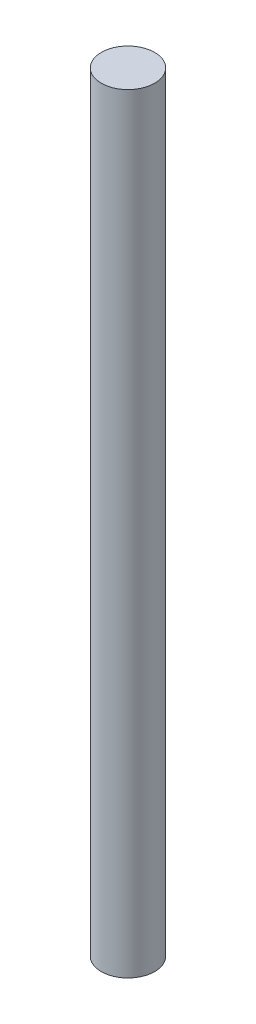
ISO-10303-21;
HEADER;
FILE_DESCRIPTION(('STEP AP214'),'2;1');
FILE_NAME('part.step','',(''),(''),'','','');
FILE_SCHEMA(('AUTOMOTIVE_DESIGN { 1 0 10303 214 1 1 1 1 }'));
ENDSEC;
DATA;
#1=APPLICATION_CONTEXT('core data for automotive mechanical design processes');
#2=APPLICATION_PROTOCOL_DEFINITION('international standard','automotive_design',2000,#1);
#3=PRODUCT_CONTEXT('',#1,'mechanical');
#4=PRODUCT('Part','Part','',(#3));
#5=PRODUCT_RELATED_PRODUCT_CATEGORY('part','',(#4));
#6=PRODUCT_DEFINITION_FORMATION('','',#4);
#7=PRODUCT_DEFINITION_CONTEXT('part definition',#1,'design');
#8=PRODUCT_DEFINITION('design','',#6,#7);
#9=PRODUCT_DEFINITION_SHAPE('','',#8);
#10=(LENGTH_UNIT() NAMED_UNIT(*) SI_UNIT(.MILLI.,.METRE.));
#11=(NAMED_UNIT(*) PLANE_ANGLE_UNIT() SI_UNIT($,.RADIAN.));
#12=(NAMED_UNIT(*) SI_UNIT($,.STERADIAN.) SOLID_ANGLE_UNIT());
#13=UNCERTAINTY_MEASURE_WITH_UNIT(LENGTH_MEASURE(1.E-05),#10,'distance_accuracy_value','');
#14=(GEOMETRIC_REPRESENTATION_CONTEXT(3) GLOBAL_UNCERTAINTY_ASSIGNED_CONTEXT((#13)) GLOBAL_UNIT_ASSIGNED_CONTEXT((#10,
#11,#12)) REPRESENTATION_CONTEXT('',''));
#15=CARTESIAN_POINT('',(0.,0.,0.));
#16=DIRECTION('',(0.,0.,1.));
#17=DIRECTION('',(1.,0.,0.));
#18=AXIS2_PLACEMENT_3D('',#15,#16,#17);
#19=CARTESIAN_POINT('',(0.,72.03,0.));
#20=DIRECTION('',(0.,-1.,0.));
#21=DIRECTION('',(0.,0.,-1.));
#22=AXIS2_PLACEMENT_3D('',#19,#20,#21);
#23=CYLINDRICAL_SURFACE('',#22,2.5);
#24=CARTESIAN_POINT('',(0.,72.03,0.));
#25=DIRECTION('',(0.,1.,0.));
#26=DIRECTION('',(0.,0.,1.));
#27=AXIS2_PLACEMENT_3D('',#24,#25,#26);
#28=CIRCLE('',#27,2.5);
#29=CARTESIAN_POINT('',(0.,72.03,2.5));
#30=VERTEX_POINT('',#29);
#31=EDGE_CURVE('E10',#30,#30,#28,.T.);
#32=ORIENTED_EDGE('',*,*,#31,.F.);
#33=EDGE_LOOP('',(#32));
#34=FACE_BOUND('',#33,.T.);
#35=CARTESIAN_POINT('',(0.,0.,0.));
#36=DIRECTION('',(0.,1.,0.));
#37=DIRECTION('',(0.,0.,1.));
#38=AXIS2_PLACEMENT_3D('',#35,#36,#37);
#39=CIRCLE('',#38,2.5);
#40=CARTESIAN_POINT('',(0.,0.,2.5));
#41=VERTEX_POINT('',#40);
#42=EDGE_CURVE('E48',#41,#41,#39,.T.);
#43=ORIENTED_EDGE('',*,*,#42,.T.);
#44=EDGE_LOOP('',(#43));
#45=FACE_BOUND('',#44,.T.);
#46=ADVANCED_FACE('F45',(#34,#45),#23,.T.);
#47=CARTESIAN_POINT('',(0.,72.03,0.));
#48=DIRECTION('',(0.,1.,0.));
#49=DIRECTION('',(0.,0.,1.));
#50=AXIS2_PLACEMENT_3D('',#47,#48,#49);
#51=PLANE('',#50);
#52=ORIENTED_EDGE('',*,*,#31,.T.);
#53=EDGE_LOOP('',(#52));
#54=FACE_BOUND('',#53,.T.);
#55=ADVANCED_FACE('F62',(#54),#51,.T.);
#56=CARTESIAN_POINT('',(0.,0.,0.));
#57=DIRECTION('',(0.,1.,0.));
#58=DIRECTION('',(0.,0.,1.));
#59=AXIS2_PLACEMENT_3D('',#56,#57,#58);
#60=PLANE('',#59);
#61=ORIENTED_EDGE('',*,*,#42,.F.);
#62=EDGE_LOOP('',(#61));
#63=FACE_BOUND('',#62,.T.);
#64=ADVANCED_FACE('F60',(#63),#60,.F.);
#65=CLOSED_SHELL('',(#46,#55,#64));
#66=MANIFOLD_SOLID_BREP('B2',#65);
#67=ADVANCED_BREP_SHAPE_REPRESENTATION('',(#18,#66),#14);
#68=SHAPE_DEFINITION_REPRESENTATION(#9,#67);
ENDSEC;
END-ISO-10303-21;
